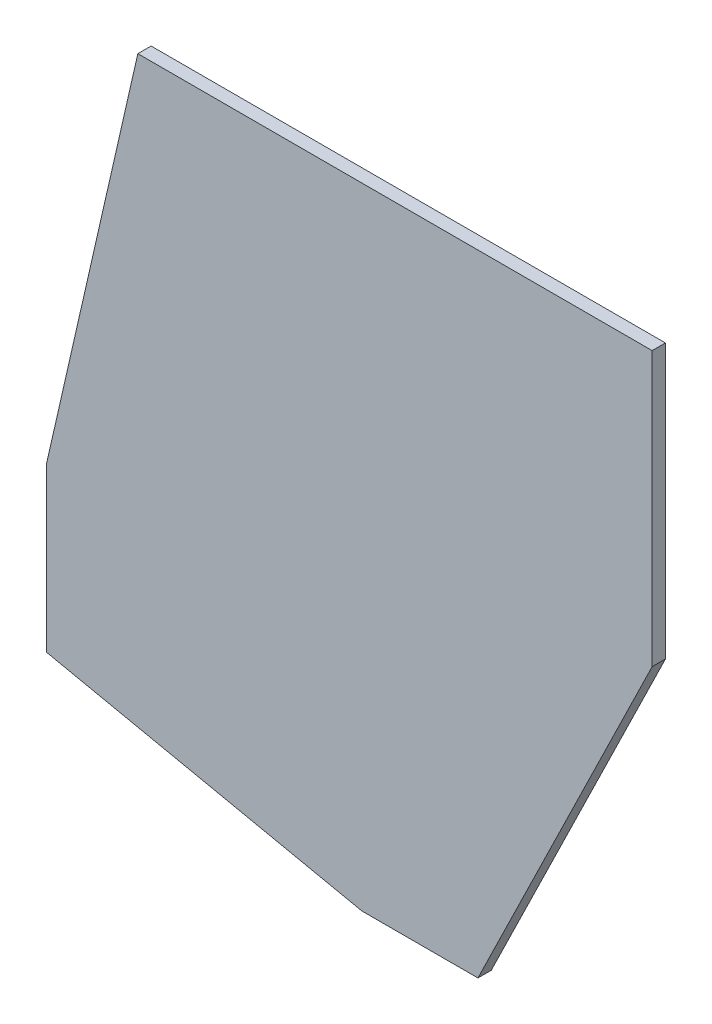
ISO-10303-21;
HEADER;
FILE_DESCRIPTION(('STEP AP214'),'2;1');
FILE_NAME('part.step','',(''),(''),'','','');
FILE_SCHEMA(('AUTOMOTIVE_DESIGN { 1 0 10303 214 1 1 1 1 }'));
ENDSEC;
DATA;
#1=APPLICATION_CONTEXT('core data for automotive mechanical design processes');
#2=APPLICATION_PROTOCOL_DEFINITION('international standard','automotive_design',2000,#1);
#3=PRODUCT_CONTEXT('',#1,'mechanical');
#4=PRODUCT('Part','Part','',(#3));
#5=PRODUCT_RELATED_PRODUCT_CATEGORY('part','',(#4));
#6=PRODUCT_DEFINITION_FORMATION('','',#4);
#7=PRODUCT_DEFINITION_CONTEXT('part definition',#1,'design');
#8=PRODUCT_DEFINITION('design','',#6,#7);
#9=PRODUCT_DEFINITION_SHAPE('','',#8);
#10=(LENGTH_UNIT() NAMED_UNIT(*) SI_UNIT(.MILLI.,.METRE.));
#11=(NAMED_UNIT(*) PLANE_ANGLE_UNIT() SI_UNIT($,.RADIAN.));
#12=(NAMED_UNIT(*) SI_UNIT($,.STERADIAN.) SOLID_ANGLE_UNIT());
#13=UNCERTAINTY_MEASURE_WITH_UNIT(LENGTH_MEASURE(1.E-05),#10,'distance_accuracy_value','');
#14=(GEOMETRIC_REPRESENTATION_CONTEXT(3) GLOBAL_UNCERTAINTY_ASSIGNED_CONTEXT((#13)) GLOBAL_UNIT_ASSIGNED_CONTEXT((#10,
#11,#12)) REPRESENTATION_CONTEXT('',''));
#15=CARTESIAN_POINT('',(0.,0.,0.));
#16=DIRECTION('',(0.,0.,1.));
#17=DIRECTION('',(1.,0.,0.));
#18=AXIS2_PLACEMENT_3D('',#15,#16,#17);
#19=CARTESIAN_POINT('',(730.,0.,16.));
#20=DIRECTION('',(-1.,0.,0.));
#21=DIRECTION('',(0.,0.,1.));
#22=AXIS2_PLACEMENT_3D('',#19,#20,#21);
#23=PLANE('',#22);
#24=DIRECTION('',(0.,1.,0.));
#25=VECTOR('',#24,1.);
#26=CARTESIAN_POINT('',(730.,0.,0.));
#27=LINE('',#26,#25);
#28=CARTESIAN_POINT('',(730.,-330.,0.));
#29=VERTEX_POINT('',#28);
#30=CARTESIAN_POINT('',(730.,0.,0.));
#31=VERTEX_POINT('',#30);
#32=EDGE_CURVE('E120',#29,#31,#27,.T.);
#33=ORIENTED_EDGE('',*,*,#32,.T.);
#34=DIRECTION('',(0.,0.,-1.));
#35=VECTOR('',#34,1.);
#36=CARTESIAN_POINT('',(730.,0.,16.));
#37=LINE('',#36,#35);
#38=CARTESIAN_POINT('',(730.,0.,16.));
#39=VERTEX_POINT('',#38);
#40=EDGE_CURVE('E11',#39,#31,#37,.T.);
#41=ORIENTED_EDGE('',*,*,#40,.F.);
#42=DIRECTION('',(0.,1.,0.));
#43=VECTOR('',#42,1.);
#44=CARTESIAN_POINT('',(730.,0.,16.));
#45=LINE('',#44,#43);
#46=CARTESIAN_POINT('',(730.,-330.,16.));
#47=VERTEX_POINT('',#46);
#48=EDGE_CURVE('E132',#47,#39,#45,.T.);
#49=ORIENTED_EDGE('',*,*,#48,.F.);
#50=DIRECTION('',(0.,0.,-1.));
#51=VECTOR('',#50,1.);
#52=CARTESIAN_POINT('',(730.,-330.,16.));
#53=LINE('',#52,#51);
#54=EDGE_CURVE('E116',#47,#29,#53,.T.);
#55=ORIENTED_EDGE('',*,*,#54,.T.);
#56=EDGE_LOOP('',(#33,#41,#49,#55));
#57=FACE_BOUND('',#56,.T.);
#58=ADVANCED_FACE('F30',(#57),#23,.F.);
#59=CARTESIAN_POINT('',(110.,0.,16.));
#60=DIRECTION('',(0.,-1.,0.));
#61=DIRECTION('',(0.,0.,-1.));
#62=AXIS2_PLACEMENT_3D('',#59,#60,#61);
#63=PLANE('',#62);
#64=DIRECTION('',(-1.,0.,0.));
#65=VECTOR('',#64,1.);
#66=CARTESIAN_POINT('',(110.,0.,0.));
#67=LINE('',#66,#65);
#68=CARTESIAN_POINT('',(110.,0.,0.));
#69=VERTEX_POINT('',#68);
#70=EDGE_CURVE('E123',#31,#69,#67,.T.);
#71=ORIENTED_EDGE('',*,*,#70,.T.);
#72=DIRECTION('',(0.,0.,-1.));
#73=VECTOR('',#72,1.);
#74=CARTESIAN_POINT('',(110.,0.,16.));
#75=LINE('',#74,#73);
#76=CARTESIAN_POINT('',(110.,0.,16.));
#77=VERTEX_POINT('',#76);
#78=EDGE_CURVE('E38',#77,#69,#75,.T.);
#79=ORIENTED_EDGE('',*,*,#78,.F.);
#80=DIRECTION('',(-1.,0.,0.));
#81=VECTOR('',#80,1.);
#82=CARTESIAN_POINT('',(110.,0.,16.));
#83=LINE('',#82,#81);
#84=EDGE_CURVE('E86',#39,#77,#83,.T.);
#85=ORIENTED_EDGE('',*,*,#84,.F.);
#86=ORIENTED_EDGE('',*,*,#40,.T.);
#87=EDGE_LOOP('',(#71,#79,#85,#86));
#88=FACE_BOUND('',#87,.T.);
#89=ADVANCED_FACE('F157',(#88),#63,.F.);
#90=CARTESIAN_POINT('',(0.,-482.786642105298,16.));
#91=DIRECTION('',(0.975012356474522,-0.222150635205034,0.));
#92=DIRECTION('',(0.222150635205034,0.975012356474522,0.));
#93=AXIS2_PLACEMENT_3D('',#90,#91,#92);
#94=PLANE('',#93);
#95=DIRECTION('',(-0.222150635205034,-0.975012356474522,0.));
#96=VECTOR('',#95,1.);
#97=CARTESIAN_POINT('',(0.,-482.786642105298,0.));
#98=LINE('',#97,#96);
#99=CARTESIAN_POINT('',(0.,-482.786642105298,0.));
#100=VERTEX_POINT('',#99);
#101=EDGE_CURVE('E125',#69,#100,#98,.T.);
#102=ORIENTED_EDGE('',*,*,#101,.T.);
#103=DIRECTION('',(0.,0.,-1.));
#104=VECTOR('',#103,1.);
#105=CARTESIAN_POINT('',(0.,-482.786642105298,16.));
#106=LINE('',#105,#104);
#107=CARTESIAN_POINT('',(0.,-482.786642105298,16.));
#108=VERTEX_POINT('',#107);
#109=EDGE_CURVE('E136',#108,#100,#106,.T.);
#110=ORIENTED_EDGE('',*,*,#109,.F.);
#111=DIRECTION('',(-0.222150635205034,-0.975012356474522,0.));
#112=VECTOR('',#111,1.);
#113=CARTESIAN_POINT('',(0.,-482.786642105298,16.));
#114=LINE('',#113,#112);
#115=EDGE_CURVE('E144',#77,#108,#114,.T.);
#116=ORIENTED_EDGE('',*,*,#115,.F.);
#117=ORIENTED_EDGE('',*,*,#78,.T.);
#118=EDGE_LOOP('',(#102,#110,#116,#117));
#119=FACE_BOUND('',#118,.T.);
#120=ADVANCED_FACE('F142',(#119),#94,.F.);
#121=CARTESIAN_POINT('',(0.,-482.786642105298,16.));
#122=DIRECTION('',(1.,0.,0.));
#123=DIRECTION('',(0.,1.,0.));
#124=AXIS2_PLACEMENT_3D('',#121,#122,#123);
#125=PLANE('',#124);
#126=DIRECTION('',(0.,-1.,0.));
#127=VECTOR('',#126,1.);
#128=CARTESIAN_POINT('',(0.,-482.786642105298,0.));
#129=LINE('',#128,#127);
#130=CARTESIAN_POINT('',(1.20869745078236E-13,-680.,0.));
#131=VERTEX_POINT('',#130);
#132=EDGE_CURVE('E127',#100,#131,#129,.T.);
#133=ORIENTED_EDGE('',*,*,#132,.T.);
#134=DIRECTION('',(0.,0.,-1.));
#135=VECTOR('',#134,1.);
#136=CARTESIAN_POINT('',(1.20869745078236E-13,-680.,16.));
#137=LINE('',#136,#135);
#138=CARTESIAN_POINT('',(1.20869745078236E-13,-680.,16.));
#139=VERTEX_POINT('',#138);
#140=EDGE_CURVE('E111',#139,#131,#137,.T.);
#141=ORIENTED_EDGE('',*,*,#140,.F.);
#142=DIRECTION('',(0.,-1.,0.));
#143=VECTOR('',#142,1.);
#144=CARTESIAN_POINT('',(0.,-482.786642105298,16.));
#145=LINE('',#144,#143);
#146=EDGE_CURVE('E102',#108,#139,#145,.T.);
#147=ORIENTED_EDGE('',*,*,#146,.F.);
#148=ORIENTED_EDGE('',*,*,#109,.T.);
#149=EDGE_LOOP('',(#133,#141,#147,#148));
#150=FACE_BOUND('',#149,.T.);
#151=ADVANCED_FACE('F150',(#150),#125,.F.);
#152=CARTESIAN_POINT('',(1.20869745078236E-13,-680.,16.));
#153=DIRECTION('',(0.206010481049842,0.978549784986749,0.));
#154=DIRECTION('',(-0.978549784986749,0.206010481049842,0.));
#155=AXIS2_PLACEMENT_3D('',#152,#153,#154);
#156=PLANE('',#155);
#157=DIRECTION('',(0.978549784986749,-0.206010481049842,0.));
#158=VECTOR('',#157,1.);
#159=CARTESIAN_POINT('',(1.20869745078236E-13,-680.,0.));
#160=LINE('',#159,#158);
#161=CARTESIAN_POINT('',(380.,-760.,0.));
#162=VERTEX_POINT('',#161);
#163=EDGE_CURVE('E110',#131,#162,#160,.T.);
#164=ORIENTED_EDGE('',*,*,#163,.T.);
#165=DIRECTION('',(0.,0.,-1.));
#166=VECTOR('',#165,1.);
#167=CARTESIAN_POINT('',(380.,-760.,16.));
#168=LINE('',#167,#166);
#169=CARTESIAN_POINT('',(380.,-760.,16.));
#170=VERTEX_POINT('',#169);
#171=EDGE_CURVE('E107',#170,#162,#168,.T.);
#172=ORIENTED_EDGE('',*,*,#171,.F.);
#173=DIRECTION('',(0.978549784986749,-0.206010481049842,0.));
#174=VECTOR('',#173,1.);
#175=CARTESIAN_POINT('',(1.20869745078236E-13,-680.,16.));
#176=LINE('',#175,#174);
#177=EDGE_CURVE('E96',#139,#170,#176,.T.);
#178=ORIENTED_EDGE('',*,*,#177,.F.);
#179=ORIENTED_EDGE('',*,*,#140,.T.);
#180=EDGE_LOOP('',(#164,#172,#178,#179));
#181=FACE_BOUND('',#180,.T.);
#182=ADVANCED_FACE('F108',(#181),#156,.F.);
#183=CARTESIAN_POINT('',(380.,-760.,16.));
#184=DIRECTION('',(0.,1.,0.));
#185=DIRECTION('',(0.,0.,1.));
#186=AXIS2_PLACEMENT_3D('',#183,#184,#185);
#187=PLANE('',#186);
#188=DIRECTION('',(1.,0.,0.));
#189=VECTOR('',#188,1.);
#190=CARTESIAN_POINT('',(380.,-760.,0.));
#191=LINE('',#190,#189);
#192=CARTESIAN_POINT('',(520.,-760.,0.));
#193=VERTEX_POINT('',#192);
#194=EDGE_CURVE('E72',#162,#193,#191,.T.);
#195=ORIENTED_EDGE('',*,*,#194,.T.);
#196=DIRECTION('',(0.,0.,-1.));
#197=VECTOR('',#196,1.);
#198=CARTESIAN_POINT('',(520.,-760.,16.));
#199=LINE('',#198,#197);
#200=CARTESIAN_POINT('',(520.,-760.,16.));
#201=VERTEX_POINT('',#200);
#202=EDGE_CURVE('E112',#201,#193,#199,.T.);
#203=ORIENTED_EDGE('',*,*,#202,.F.);
#204=DIRECTION('',(1.,0.,0.));
#205=VECTOR('',#204,1.);
#206=CARTESIAN_POINT('',(380.,-760.,16.));
#207=LINE('',#206,#205);
#208=EDGE_CURVE('E100',#170,#201,#207,.T.);
#209=ORIENTED_EDGE('',*,*,#208,.F.);
#210=ORIENTED_EDGE('',*,*,#171,.T.);
#211=EDGE_LOOP('',(#195,#203,#209,#210));
#212=FACE_BOUND('',#211,.T.);
#213=ADVANCED_FACE('F114',(#212),#187,.F.);
#214=CARTESIAN_POINT('',(730.,-330.,16.));
#215=DIRECTION('',(-0.898567515986432,0.438835298505001,0.));
#216=DIRECTION('',(-0.438835298505001,-0.898567515986432,0.));
#217=AXIS2_PLACEMENT_3D('',#214,#215,#216);
#218=PLANE('',#217);
#219=DIRECTION('',(0.438835298505001,0.898567515986432,0.));
#220=VECTOR('',#219,1.);
#221=CARTESIAN_POINT('',(730.,-330.,0.));
#222=LINE('',#221,#220);
#223=EDGE_CURVE('E78',#193,#29,#222,.T.);
#224=ORIENTED_EDGE('',*,*,#223,.T.);
#225=ORIENTED_EDGE('',*,*,#54,.F.);
#226=DIRECTION('',(0.438835298505001,0.898567515986432,0.));
#227=VECTOR('',#226,1.);
#228=CARTESIAN_POINT('',(730.,-330.,16.));
#229=LINE('',#228,#227);
#230=EDGE_CURVE('E46',#201,#47,#229,.T.);
#231=ORIENTED_EDGE('',*,*,#230,.F.);
#232=ORIENTED_EDGE('',*,*,#202,.T.);
#233=EDGE_LOOP('',(#224,#225,#231,#232));
#234=FACE_BOUND('',#233,.T.);
#235=ADVANCED_FACE('F171',(#234),#218,.F.);
#236=CARTESIAN_POINT('',(730.,-760.,16.));
#237=DIRECTION('',(0.,0.,1.));
#238=DIRECTION('',(1.,0.,0.));
#239=AXIS2_PLACEMENT_3D('',#236,#237,#238);
#240=PLANE('',#239);
#241=ORIENTED_EDGE('',*,*,#48,.T.);
#242=ORIENTED_EDGE('',*,*,#84,.T.);
#243=ORIENTED_EDGE('',*,*,#115,.T.);
#244=ORIENTED_EDGE('',*,*,#146,.T.);
#245=ORIENTED_EDGE('',*,*,#177,.T.);
#246=ORIENTED_EDGE('',*,*,#208,.T.);
#247=ORIENTED_EDGE('',*,*,#230,.T.);
#248=EDGE_LOOP('',(#241,#242,#243,#244,#245,#246,#247));
#249=FACE_BOUND('',#248,.T.);
#250=ADVANCED_FACE('F98',(#249),#240,.T.);
#251=CARTESIAN_POINT('',(730.,-760.,0.));
#252=DIRECTION('',(0.,0.,1.));
#253=DIRECTION('',(1.,0.,0.));
#254=AXIS2_PLACEMENT_3D('',#251,#252,#253);
#255=PLANE('',#254);
#256=ORIENTED_EDGE('',*,*,#32,.F.);
#257=ORIENTED_EDGE('',*,*,#223,.F.);
#258=ORIENTED_EDGE('',*,*,#194,.F.);
#259=ORIENTED_EDGE('',*,*,#163,.F.);
#260=ORIENTED_EDGE('',*,*,#132,.F.);
#261=ORIENTED_EDGE('',*,*,#101,.F.);
#262=ORIENTED_EDGE('',*,*,#70,.F.);
#263=EDGE_LOOP('',(#256,#257,#258,#259,#260,#261,#262));
#264=FACE_BOUND('',#263,.T.);
#265=ADVANCED_FACE('F148',(#264),#255,.F.);
#266=CLOSED_SHELL('',(#58,#89,#120,#151,#182,#213,#235,#250,#265));
#267=MANIFOLD_SOLID_BREP('B2',#266);
#268=ADVANCED_BREP_SHAPE_REPRESENTATION('',(#18,#267),#14);
#269=SHAPE_DEFINITION_REPRESENTATION(#9,#268);
ENDSEC;
END-ISO-10303-21;
